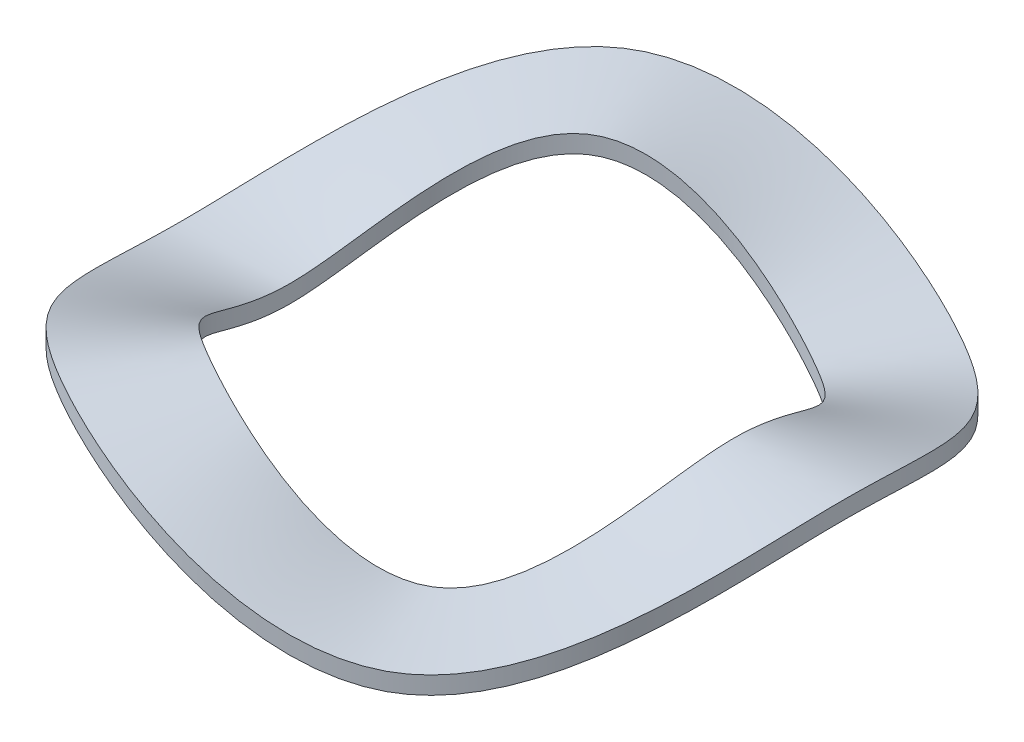
ISO-10303-21;
HEADER;
FILE_DESCRIPTION(('STEP AP214'),'2;1');
FILE_NAME('part.step','',(''),(''),'','','');
FILE_SCHEMA(('AUTOMOTIVE_DESIGN { 1 0 10303 214 1 1 1 1 }'));
ENDSEC;
DATA;
#1=APPLICATION_CONTEXT('core data for automotive mechanical design processes');
#2=APPLICATION_PROTOCOL_DEFINITION('international standard','automotive_design',2000,#1);
#3=PRODUCT_CONTEXT('',#1,'mechanical');
#4=PRODUCT('Part','Part','',(#3));
#5=PRODUCT_RELATED_PRODUCT_CATEGORY('part','',(#4));
#6=PRODUCT_DEFINITION_FORMATION('','',#4);
#7=PRODUCT_DEFINITION_CONTEXT('part definition',#1,'design');
#8=PRODUCT_DEFINITION('design','',#6,#7);
#9=PRODUCT_DEFINITION_SHAPE('','',#8);
#10=(LENGTH_UNIT() NAMED_UNIT(*) SI_UNIT(.MILLI.,.METRE.));
#11=(NAMED_UNIT(*) PLANE_ANGLE_UNIT() SI_UNIT($,.RADIAN.));
#12=(NAMED_UNIT(*) SI_UNIT($,.STERADIAN.) SOLID_ANGLE_UNIT());
#13=UNCERTAINTY_MEASURE_WITH_UNIT(LENGTH_MEASURE(1.E-05),#10,'distance_accuracy_value','');
#14=(GEOMETRIC_REPRESENTATION_CONTEXT(3) GLOBAL_UNCERTAINTY_ASSIGNED_CONTEXT((#13)) GLOBAL_UNIT_ASSIGNED_CONTEXT((#10,
#11,#12)) REPRESENTATION_CONTEXT('',''));
#15=CARTESIAN_POINT('',(0.,0.,0.));
#16=DIRECTION('',(0.,0.,1.));
#17=DIRECTION('',(1.,0.,0.));
#18=AXIS2_PLACEMENT_3D('',#15,#16,#17);
#19=CARTESIAN_POINT('',(-4.7625,0.254,0.));
#20=CARTESIAN_POINT('',(-4.76249999999884,0.254000000000156,-0.0824889197108526));
#21=CARTESIAN_POINT('',(-4.7577374999963,0.260350000000501,-0.247466759132615));
#22=CARTESIAN_POINT('',(-4.73666343749194,0.287020000001092,-0.494314851367588));
#23=CARTESIAN_POINT('',(-4.70201624998713,0.328930000001738,-0.739925609807044));
#24=CARTESIAN_POINT('',(-4.41483749996096,0.660400000000268,-2.20245415625919));
#25=CARTESIAN_POINT('',(-2.47649999987054,2.54000000001252,-4.94933518268951));
#26=CARTESIAN_POINT('',(2.85749999982982,-1.01600000000891,-4.94933518270923));
#27=CARTESIAN_POINT('',(5.71500000003228,2.7939999999834,6.43517764032861E-11));
#28=CARTESIAN_POINT('',(2.85749999998143,-1.01600000000423,4.94933518262236));
#29=CARTESIAN_POINT('',(-2.47649999998527,2.54000000000209,4.94933518262739));
#30=CARTESIAN_POINT('',(-4.41483750001662,0.660399999997793,2.20245415627529));
#31=CARTESIAN_POINT('',(-4.70201625000777,0.328929999998984,0.739925609805655));
#32=CARTESIAN_POINT('',(-4.7366634375058,0.287019999999233,0.494314851366983));
#33=CARTESIAN_POINT('',(-4.75773750000326,0.260349999999564,0.247466759132501));
#34=CARTESIAN_POINT('',(-4.76250000000116,0.253999999999844,0.0824889197108527));
#35=CARTESIAN_POINT('',(-4.7625,0.254,0.));
#36=CARTESIAN_POINT('',(-4.2418,0.254,0.));
#37=CARTESIAN_POINT('',(-4.24179999999897,0.254000000000156,-0.0734701311557993));
#38=CARTESIAN_POINT('',(-4.23755819999671,0.260350000000501,-0.220410393467449));
#39=CARTESIAN_POINT('',(-4.21878823499282,0.287020000001092,-0.440269760951398));
#40=CARTESIAN_POINT('',(-4.18792913998854,0.328930000001738,-0.65902707646814));
#41=CARTESIAN_POINT('',(-3.93214859996523,0.660400000000268,-1.96165250184152));
#42=CARTESIAN_POINT('',(-2.2057359998847,2.54000000001252,-4.40820786938212));
#43=CARTESIAN_POINT('',(2.54507999984843,-1.01600000000891,-4.40820786939969));
#44=CARTESIAN_POINT('',(5.09016000002875,2.7939999999834,5.7316158113066E-11));
#45=CARTESIAN_POINT('',(2.54507999998346,-1.01600000000423,4.40820786932231));
#46=CARTESIAN_POINT('',(-2.20573599998688,2.54000000000209,4.40820786932679));
#47=CARTESIAN_POINT('',(-3.9321486000148,0.660399999997793,1.96165250185586));
#48=CARTESIAN_POINT('',(-4.18792914000692,0.328929999998984,0.659027076466904));
#49=CARTESIAN_POINT('',(-4.21878823500517,0.287019999999233,0.44026976095086));
#50=CARTESIAN_POINT('',(-4.2375582000029,0.260349999999564,0.220410393467348));
#51=CARTESIAN_POINT('',(-4.24180000000103,0.253999999999844,0.0734701311557996));
#52=CARTESIAN_POINT('',(-4.2418,0.254,0.));
#53=CARTESIAN_POINT('',(-3.7211,0.254,0.));
#54=CARTESIAN_POINT('',(-3.72109999999909,0.254000000000156,-0.0644513426007462));
#55=CARTESIAN_POINT('',(-3.71737889999711,0.260350000000501,-0.193354027802283));
#56=CARTESIAN_POINT('',(-3.7009130324937,0.287020000001092,-0.386224670535208));
#57=CARTESIAN_POINT('',(-3.67384202998994,0.328930000001738,-0.578128543129237));
#58=CARTESIAN_POINT('',(-3.4494596999695,0.660400000000268,-1.72085084742385));
#59=CARTESIAN_POINT('',(-1.93497199989885,2.54000000001252,-3.86708055607473));
#60=CARTESIAN_POINT('',(2.23265999986704,-1.01600000000891,-3.86708055609015));
#61=CARTESIAN_POINT('',(4.46532000002522,2.7939999999834,5.02800451556047E-11));
#62=CARTESIAN_POINT('',(2.23265999998549,-1.01600000000423,3.86708055602227));
#63=CARTESIAN_POINT('',(-1.93497199998849,2.54000000000209,3.8670805560262));
#64=CARTESIAN_POINT('',(-3.44945970001299,0.660399999997793,1.72085084743642));
#65=CARTESIAN_POINT('',(-3.67384203000607,0.328929999998984,0.578128543128152));
#66=CARTESIAN_POINT('',(-3.70091303250453,0.287019999999233,0.386224670534736));
#67=CARTESIAN_POINT('',(-3.71737890000255,0.260349999999564,0.193354027802194));
#68=CARTESIAN_POINT('',(-3.72110000000091,0.253999999999844,0.0644513426007462));
#69=CARTESIAN_POINT('',(-3.7211,0.254,0.));
#70=CARTESIAN_POINT('',(-3.2004,0.254,0.));
#71=CARTESIAN_POINT('',(-3.20039999999922,0.254000000000156,-0.0554325540456928));
#72=CARTESIAN_POINT('',(-3.19719959999752,0.260350000000501,-0.166297662137117));
#73=CARTESIAN_POINT('',(-3.18303782999458,0.287020000001092,-0.332179580119019));
#74=CARTESIAN_POINT('',(-3.15975491999135,0.328930000001738,-0.497230009790333));
#75=CARTESIAN_POINT('',(-2.96677079997376,0.660400000000268,-1.48004919300618));
#76=CARTESIAN_POINT('',(-1.664207999913,2.54000000001252,-3.32595324276735));
#77=CARTESIAN_POINT('',(1.92023999988564,-1.01600000000891,-3.3259532427806));
#78=CARTESIAN_POINT('',(3.84048000002169,2.7939999999834,4.32446335414238E-11));
#79=CARTESIAN_POINT('',(1.92023999998752,-1.01600000000423,3.32595324272222));
#80=CARTESIAN_POINT('',(-1.6642079999901,2.54000000000209,3.3259532427256));
#81=CARTESIAN_POINT('',(-2.96677080001117,0.660399999997793,1.48004919301699));
#82=CARTESIAN_POINT('',(-3.15975492000523,0.328929999998984,0.4972300097894));
#83=CARTESIAN_POINT('',(-3.1830378300039,0.287019999999233,0.332179580118612));
#84=CARTESIAN_POINT('',(-3.19719960000219,0.260349999999564,0.166297662137041));
#85=CARTESIAN_POINT('',(-3.20040000000078,0.253999999999844,0.055432554045693));
#86=CARTESIAN_POINT('',(-3.2004,0.254,0.));
#87=B_SPLINE_SURFACE_WITH_KNOTS('',3,3,((#19,#20,#21,#22,#23,#24,#25,#26,#27,#28,#29,#30,#31,
#32,#33,#34,#35),(#36,#37,#38,#39,#40,#41,#42,#43,#44,#45,#46,#47,#48,#49,#50,#51,#52),(#53,#54,
#55,#56,#57,#58,#59,#60,#61,#62,#63,#64,#65,#66,#67,#68,#69),(#70,#71,#72,#73,#74,#75,#76,#77,
#78,#79,#80,#81,#82,#83,#84,#85,#86)),.UNSPECIFIED.,.F.,.T.,.F.,(4,4),(4,1,1,1,1,1,1,1,1,1,1,1,
1,1,4),(0.,1.),(0.,0.0083333333333333,0.0166666666666666,0.0250000000000001,0.0333333333333334,
0.166666666664162,0.333333333337267,0.5,0.666666666666667,0.833333333333398,0.966666666666667,
0.975,0.983333333333333,0.991666666666667,1.),.UNSPECIFIED.);
#88=CARTESIAN_POINT('',(-4.7625,0.254,0.));
#89=CARTESIAN_POINT('',(-4.76249999999884,0.254000000000156,-0.0824889197108526));
#90=CARTESIAN_POINT('',(-4.7577374999963,0.260350000000501,-0.247466759132615));
#91=CARTESIAN_POINT('',(-4.73666343749194,0.287020000001092,-0.494314851367588));
#92=CARTESIAN_POINT('',(-4.70201624998713,0.328930000001738,-0.739925609807044));
#93=CARTESIAN_POINT('',(-4.41483749996096,0.660400000000268,-2.20245415625919));
#94=CARTESIAN_POINT('',(-2.47649999987054,2.54000000001252,-4.94933518268951));
#95=CARTESIAN_POINT('',(2.85749999982982,-1.01600000000891,-4.94933518270923));
#96=CARTESIAN_POINT('',(5.71500000003228,2.7939999999834,6.43517764032861E-11));
#97=CARTESIAN_POINT('',(2.85749999998143,-1.01600000000423,4.94933518262236));
#98=CARTESIAN_POINT('',(-2.47649999998527,2.54000000000209,4.94933518262739));
#99=CARTESIAN_POINT('',(-4.41483750001662,0.660399999997793,2.20245415627529));
#100=CARTESIAN_POINT('',(-4.70201625000777,0.328929999998984,0.739925609805655));
#101=CARTESIAN_POINT('',(-4.7366634375058,0.287019999999233,0.494314851366983));
#102=CARTESIAN_POINT('',(-4.75773750000326,0.260349999999564,0.247466759132501));
#103=CARTESIAN_POINT('',(-4.76250000000116,0.253999999999844,0.0824889197108527));
#104=CARTESIAN_POINT('',(-4.7625,0.254,0.));
#105=B_SPLINE_CURVE_WITH_KNOTS('',3,(#88,#89,#90,#91,#92,#93,#94,#95,#96,#97,#98,#99,#100,#101,
#102,#103,#104),.UNSPECIFIED.,.T.,.F.,(4,1,1,1,1,1,1,1,1,1,1,1,1,1,4),(0.,0.0083333333333333,
0.0166666666666666,0.0250000000000001,0.0333333333333334,0.166666666664162,0.333333333337267,
0.5,0.666666666666667,0.833333333333398,0.966666666666667,0.975,0.983333333333333,
0.991666666666667,1.),.UNSPECIFIED.);
#106=CARTESIAN_POINT('',(-4.7625,0.254,0.));
#107=VERTEX_POINT('',#106);
#108=EDGE_CURVE('E11',#107,#107,#105,.F.);
#109=CARTESIAN_POINT('',(-3.2004,0.254,0.));
#110=CARTESIAN_POINT('',(-3.20039999999922,0.254000000000156,-0.0554325540456928));
#111=CARTESIAN_POINT('',(-3.19719959999752,0.260350000000501,-0.166297662137117));
#112=CARTESIAN_POINT('',(-3.18303782999458,0.287020000001092,-0.332179580119019));
#113=CARTESIAN_POINT('',(-3.15975491999135,0.328930000001738,-0.497230009790333));
#114=CARTESIAN_POINT('',(-2.96677079997376,0.660400000000268,-1.48004919300618));
#115=CARTESIAN_POINT('',(-1.664207999913,2.54000000001252,-3.32595324276735));
#116=CARTESIAN_POINT('',(1.92023999988564,-1.01600000000891,-3.3259532427806));
#117=CARTESIAN_POINT('',(3.84048000002169,2.7939999999834,4.32446335414238E-11));
#118=CARTESIAN_POINT('',(1.92023999998752,-1.01600000000423,3.32595324272222));
#119=CARTESIAN_POINT('',(-1.6642079999901,2.54000000000209,3.3259532427256));
#120=CARTESIAN_POINT('',(-2.96677080001117,0.660399999997793,1.48004919301699));
#121=CARTESIAN_POINT('',(-3.15975492000523,0.328929999998984,0.4972300097894));
#122=CARTESIAN_POINT('',(-3.1830378300039,0.287019999999233,0.332179580118612));
#123=CARTESIAN_POINT('',(-3.19719960000219,0.260349999999564,0.166297662137041));
#124=CARTESIAN_POINT('',(-3.20040000000078,0.253999999999844,0.055432554045693));
#125=CARTESIAN_POINT('',(-3.2004,0.254,0.));
#126=B_SPLINE_CURVE_WITH_KNOTS('',3,(#109,#110,#111,#112,#113,#114,#115,#116,#117,#118,#119,
#120,#121,#122,#123,#124,#125),.UNSPECIFIED.,.T.,.F.,(4,1,1,1,1,1,1,1,1,1,1,1,1,1,4),(0.,
0.0083333333333333,0.0166666666666666,0.0250000000000001,0.0333333333333334,0.166666666664162,
0.333333333337267,0.5,0.666666666666667,0.833333333333398,0.966666666666667,0.975,
0.983333333333333,0.991666666666667,1.),.UNSPECIFIED.);
#127=CARTESIAN_POINT('',(-3.2004,0.254,0.));
#128=VERTEX_POINT('',#127);
#129=EDGE_CURVE('E58',#128,#128,#126,.T.);
#130=ORIENTED_EDGE('',*,*,#108,.T.);
#131=EDGE_LOOP('',(#130));
#132=FACE_BOUND('',#131,.T.);
#133=ORIENTED_EDGE('',*,*,#129,.T.);
#134=EDGE_LOOP('',(#133));
#135=FACE_BOUND('',#134,.T.);
#136=ADVANCED_FACE('F46',(#132,#135),#87,.T.);
#137=CARTESIAN_POINT('',(-4.7625,0.,0.));
#138=CARTESIAN_POINT('',(-4.76249999999884,1.55996787346404E-13,-0.0824889197108526));
#139=CARTESIAN_POINT('',(-4.7577374999963,0.00635000000050028,-0.247466759132615));
#140=CARTESIAN_POINT('',(-4.73666343749194,0.033020000001092,-0.494314851367587));
#141=CARTESIAN_POINT('',(-4.70201624998713,0.0749300000017376,-0.739925609807044));
#142=CARTESIAN_POINT('',(-4.41483749996096,0.406400000000268,-2.20245415625919));
#143=CARTESIAN_POINT('',(-2.47649999987054,2.28600000001252,-4.9493351826895));
#144=CARTESIAN_POINT('',(2.85749999982982,-1.27000000000891,-4.94933518270923));
#145=CARTESIAN_POINT('',(5.71500000003228,2.5399999999834,6.43517560744954E-11));
#146=CARTESIAN_POINT('',(2.85749999998143,-1.27000000000423,4.94933518262236));
#147=CARTESIAN_POINT('',(-2.47649999998527,2.28600000000209,4.94933518262739));
#148=CARTESIAN_POINT('',(-4.41483750001662,0.406399999997793,2.20245415627529));
#149=CARTESIAN_POINT('',(-4.70201625000778,0.0749299999989841,0.739925609805655));
#150=CARTESIAN_POINT('',(-4.7366634375058,0.0330199999992332,0.494314851366983));
#151=CARTESIAN_POINT('',(-4.75773750000326,0.00634999999956399,0.247466759132501));
#152=CARTESIAN_POINT('',(-4.76250000000116,-1.56099701849495E-13,0.0824889197108527));
#153=CARTESIAN_POINT('',(-4.7625,0.,0.));
#154=CARTESIAN_POINT('',(-4.7625,0.0211666666666668,0.));
#155=CARTESIAN_POINT('',(-4.76249999999884,0.0211666666668228,-0.0824889197108526));
#156=CARTESIAN_POINT('',(-4.7577374999963,0.0275166666671671,-0.247466759132615));
#157=CARTESIAN_POINT('',(-4.73666343749194,0.0541866666677588,-0.494314851367587));
#158=CARTESIAN_POINT('',(-4.70201624998713,0.0960966666684045,-0.739925609807044));
#159=CARTESIAN_POINT('',(-4.41483749996096,0.427566666666935,-2.20245415625919));
#160=CARTESIAN_POINT('',(-2.47649999987054,2.30716666667919,-4.9493351826895));
#161=CARTESIAN_POINT('',(2.85749999982982,-1.24883333334224,-4.94933518270923));
#162=CARTESIAN_POINT('',(5.71500000003228,2.56116666665007,6.43517560744954E-11));
#163=CARTESIAN_POINT('',(2.85749999998143,-1.24883333333756,4.94933518262236));
#164=CARTESIAN_POINT('',(-2.47649999998527,2.30716666666876,4.94933518262739));
#165=CARTESIAN_POINT('',(-4.41483750001662,0.42756666666446,2.20245415627529));
#166=CARTESIAN_POINT('',(-4.70201625000778,0.0960966666656509,0.739925609805655));
#167=CARTESIAN_POINT('',(-4.7366634375058,0.0541866666659001,0.494314851366983));
#168=CARTESIAN_POINT('',(-4.75773750000326,0.0275166666662308,0.247466759132501));
#169=CARTESIAN_POINT('',(-4.76250000000116,0.0211666666665107,0.0824889197108527));
#170=CARTESIAN_POINT('',(-4.7625,0.0211666666666668,0.));
#171=CARTESIAN_POINT('',(-4.7625,0.0635000000000002,0.));
#172=CARTESIAN_POINT('',(-4.76249999999884,0.0635000000001563,-0.0824889197108526));
#173=CARTESIAN_POINT('',(-4.7577374999963,0.0698500000005006,-0.247466759132615));
#174=CARTESIAN_POINT('',(-4.73666343749194,0.0965200000010923,-0.494314851367588));
#175=CARTESIAN_POINT('',(-4.70201624998713,0.138430000001738,-0.739925609807044));
#176=CARTESIAN_POINT('',(-4.41483749996096,0.469900000000268,-2.20245415625919));
#177=CARTESIAN_POINT('',(-2.47649999987055,2.34950000001252,-4.9493351826895));
#178=CARTESIAN_POINT('',(2.85749999982983,-1.20650000000891,-4.94933518270923));
#179=CARTESIAN_POINT('',(5.71500000003227,2.6034999999834,6.4353768624778E-11));
#180=CARTESIAN_POINT('',(2.85749999998143,-1.20650000000422,4.94933518262236));
#181=CARTESIAN_POINT('',(-2.47649999998528,2.34950000000209,4.94933518262739));
#182=CARTESIAN_POINT('',(-4.41483750001662,0.469899999997793,2.20245415627529));
#183=CARTESIAN_POINT('',(-4.70201625000777,0.138429999998984,0.739925609805655));
#184=CARTESIAN_POINT('',(-4.7366634375058,0.0965199999992334,0.494314851366983));
#185=CARTESIAN_POINT('',(-4.75773750000326,0.0698499999995642,0.247466759132501));
#186=CARTESIAN_POINT('',(-4.76250000000116,0.0634999999998442,0.0824889197108526));
#187=CARTESIAN_POINT('',(-4.7625,0.0635000000000002,0.));
#188=CARTESIAN_POINT('',(-4.7625,0.127,0.));
#189=CARTESIAN_POINT('',(-4.76249999999884,0.127000000000156,-0.0824889197108527));
#190=CARTESIAN_POINT('',(-4.75773749999631,0.133350000000501,-0.247466759132615));
#191=CARTESIAN_POINT('',(-4.73666343749195,0.160020000001092,-0.494314851367588));
#192=CARTESIAN_POINT('',(-4.70201624998713,0.201930000001738,-0.739925609807044));
#193=CARTESIAN_POINT('',(-4.41483749996096,0.533400000000269,-2.20245415625919));
#194=CARTESIAN_POINT('',(-2.47649999987054,2.41300000001252,-4.94933518268951));
#195=CARTESIAN_POINT('',(2.85749999982981,-1.14300000000891,-4.94933518270922));
#196=CARTESIAN_POINT('',(5.71500000003229,2.66699999998341,6.43488829387383E-11));
#197=CARTESIAN_POINT('',(2.85749999998142,-1.14300000000423,4.94933518262236));
#198=CARTESIAN_POINT('',(-2.47649999998526,2.4130000000021,4.94933518262738));
#199=CARTESIAN_POINT('',(-4.41483750001662,0.533399999997794,2.20245415627529));
#200=CARTESIAN_POINT('',(-4.70201625000778,0.201929999998985,0.739925609805655));
#201=CARTESIAN_POINT('',(-4.7366634375058,0.160019999999234,0.494314851366983));
#202=CARTESIAN_POINT('',(-4.75773750000326,0.133349999999564,0.247466759132501));
#203=CARTESIAN_POINT('',(-4.76250000000116,0.126999999999844,0.0824889197108526));
#204=CARTESIAN_POINT('',(-4.7625,0.127,0.));
#205=CARTESIAN_POINT('',(-4.7625,0.1905,0.));
#206=CARTESIAN_POINT('',(-4.76249999999884,0.190500000000156,-0.0824889197108527));
#207=CARTESIAN_POINT('',(-4.7577374999963,0.196850000000501,-0.247466759132615));
#208=CARTESIAN_POINT('',(-4.73666343749194,0.223520000001092,-0.494314851367588));
#209=CARTESIAN_POINT('',(-4.70201624998713,0.265430000001738,-0.739925609807044));
#210=CARTESIAN_POINT('',(-4.41483749996096,0.596900000000268,-2.20245415625919));
#211=CARTESIAN_POINT('',(-2.47649999987055,2.47650000001252,-4.9493351826895));
#212=CARTESIAN_POINT('',(2.85749999982983,-1.07950000000891,-4.94933518270923));
#213=CARTESIAN_POINT('',(5.71500000003227,2.7304999999834,6.43526708700784E-11));
#214=CARTESIAN_POINT('',(2.85749999998143,-1.07950000000422,4.94933518262236));
#215=CARTESIAN_POINT('',(-2.47649999998528,2.47650000000209,4.94933518262739));
#216=CARTESIAN_POINT('',(-4.41483750001662,0.596899999997792,2.20245415627529));
#217=CARTESIAN_POINT('',(-4.70201625000777,0.265429999998984,0.739925609805655));
#218=CARTESIAN_POINT('',(-4.7366634375058,0.223519999999233,0.494314851366983));
#219=CARTESIAN_POINT('',(-4.75773750000326,0.196849999999564,0.247466759132501));
#220=CARTESIAN_POINT('',(-4.76250000000116,0.190499999999844,0.0824889197108525));
#221=CARTESIAN_POINT('',(-4.7625,0.1905,0.));
#222=CARTESIAN_POINT('',(-4.7625,0.232833333333333,0.));
#223=CARTESIAN_POINT('',(-4.76249999999884,0.232833333333489,-0.0824889197108526));
#224=CARTESIAN_POINT('',(-4.7577374999963,0.239183333333834,-0.247466759132615));
#225=CARTESIAN_POINT('',(-4.73666343749194,0.265853333334425,-0.494314851367588));
#226=CARTESIAN_POINT('',(-4.70201624998713,0.307763333335071,-0.739925609807044));
#227=CARTESIAN_POINT('',(-4.41483749996096,0.639233333333601,-2.20245415625919));
#228=CARTESIAN_POINT('',(-2.47649999987054,2.51883333334585,-4.9493351826895));
#229=CARTESIAN_POINT('',(2.85749999982982,-1.03716666667557,-4.94933518270923));
#230=CARTESIAN_POINT('',(5.71500000003228,2.77283333331674,6.43519593624027E-11));
#231=CARTESIAN_POINT('',(2.85749999998143,-1.03716666667089,4.94933518262236));
#232=CARTESIAN_POINT('',(-2.47649999998527,2.51883333333543,4.94933518262739));
#233=CARTESIAN_POINT('',(-4.41483750001662,0.639233333331126,2.20245415627529));
#234=CARTESIAN_POINT('',(-4.70201625000777,0.307763333332317,0.739925609805655));
#235=CARTESIAN_POINT('',(-4.7366634375058,0.265853333332567,0.494314851366983));
#236=CARTESIAN_POINT('',(-4.75773750000326,0.239183333332897,0.247466759132501));
#237=CARTESIAN_POINT('',(-4.76250000000116,0.232833333333177,0.0824889197108526));
#238=CARTESIAN_POINT('',(-4.7625,0.232833333333333,0.));
#239=CARTESIAN_POINT('',(-4.7625,0.254,0.));
#240=CARTESIAN_POINT('',(-4.76249999999884,0.254000000000156,-0.0824889197108526));
#241=CARTESIAN_POINT('',(-4.7577374999963,0.260350000000501,-0.247466759132615));
#242=CARTESIAN_POINT('',(-4.73666343749194,0.287020000001092,-0.494314851367588));
#243=CARTESIAN_POINT('',(-4.70201624998713,0.328930000001738,-0.739925609807044));
#244=CARTESIAN_POINT('',(-4.41483749996096,0.660400000000268,-2.20245415625919));
#245=CARTESIAN_POINT('',(-2.47649999987054,2.54000000001252,-4.9493351826895));
#246=CARTESIAN_POINT('',(2.85749999982982,-1.01600000000891,-4.94933518270923));
#247=CARTESIAN_POINT('',(5.71500000003228,2.7939999999834,6.43519593624027E-11));
#248=CARTESIAN_POINT('',(2.85749999998143,-1.01600000000423,4.94933518262236));
#249=CARTESIAN_POINT('',(-2.47649999998527,2.54000000000209,4.94933518262739));
#250=CARTESIAN_POINT('',(-4.41483750001662,0.660399999997793,2.20245415627529));
#251=CARTESIAN_POINT('',(-4.70201625000777,0.328929999998984,0.739925609805655));
#252=CARTESIAN_POINT('',(-4.7366634375058,0.287019999999233,0.494314851366983));
#253=CARTESIAN_POINT('',(-4.75773750000326,0.260349999999564,0.247466759132501));
#254=CARTESIAN_POINT('',(-4.76250000000116,0.253999999999844,0.0824889197108526));
#255=CARTESIAN_POINT('',(-4.7625,0.254,0.));
#256=B_SPLINE_SURFACE_WITH_KNOTS('',3,3,((#137,#138,#139,#140,#141,#142,#143,#144,#145,#146,
#147,#148,#149,#150,#151,#152,#153),(#154,#155,#156,#157,#158,#159,#160,#161,#162,#163,#164,
#165,#166,#167,#168,#169,#170),(#171,#172,#173,#174,#175,#176,#177,#178,#179,#180,#181,#182,
#183,#184,#185,#186,#187),(#188,#189,#190,#191,#192,#193,#194,#195,#196,#197,#198,#199,#200,
#201,#202,#203,#204),(#205,#206,#207,#208,#209,#210,#211,#212,#213,#214,#215,#216,#217,#218,
#219,#220,#221),(#222,#223,#224,#225,#226,#227,#228,#229,#230,#231,#232,#233,#234,#235,#236,
#237,#238),(#239,#240,#241,#242,#243,#244,#245,#246,#247,#248,#249,#250,#251,#252,#253,#254,
#255)),.UNSPECIFIED.,.F.,.T.,.F.,(4,1,1,1,4),(4,1,1,1,1,1,1,1,1,1,1,1,1,1,4),(0.877300613496933,
0.907975460122699,0.938650306748466,0.969325153374233,1.),(0.,0.0083333333333333,
0.0166666666666666,0.0250000000000001,0.0333333333333334,0.166666666664162,0.333333333337267,
0.5,0.666666666666667,0.833333333333398,0.966666666666667,0.975,0.983333333333333,
0.991666666666667,1.),.UNSPECIFIED.);
#257=CARTESIAN_POINT('',(-4.7625,0.,0.));
#258=CARTESIAN_POINT('',(-4.76249999999884,1.55996787346404E-13,-0.0824889197108526));
#259=CARTESIAN_POINT('',(-4.7577374999963,0.00635000000050028,-0.247466759132615));
#260=CARTESIAN_POINT('',(-4.73666343749194,0.033020000001092,-0.494314851367587));
#261=CARTESIAN_POINT('',(-4.70201624998713,0.0749300000017376,-0.739925609807044));
#262=CARTESIAN_POINT('',(-4.41483749996096,0.406400000000268,-2.20245415625919));
#263=CARTESIAN_POINT('',(-2.47649999987054,2.28600000001252,-4.9493351826895));
#264=CARTESIAN_POINT('',(2.85749999982982,-1.27000000000891,-4.94933518270923));
#265=CARTESIAN_POINT('',(5.71500000003228,2.5399999999834,6.43517560744954E-11));
#266=CARTESIAN_POINT('',(2.85749999998143,-1.27000000000423,4.94933518262236));
#267=CARTESIAN_POINT('',(-2.47649999998527,2.28600000000209,4.94933518262739));
#268=CARTESIAN_POINT('',(-4.41483750001662,0.406399999997793,2.20245415627529));
#269=CARTESIAN_POINT('',(-4.70201625000778,0.0749299999989841,0.739925609805655));
#270=CARTESIAN_POINT('',(-4.7366634375058,0.0330199999992332,0.494314851366983));
#271=CARTESIAN_POINT('',(-4.75773750000326,0.00634999999956399,0.247466759132501));
#272=CARTESIAN_POINT('',(-4.76250000000116,-1.56099701849495E-13,0.0824889197108527));
#273=CARTESIAN_POINT('',(-4.7625,0.,0.));
#274=B_SPLINE_CURVE_WITH_KNOTS('',3,(#257,#258,#259,#260,#261,#262,#263,#264,#265,#266,#267,
#268,#269,#270,#271,#272,#273),.UNSPECIFIED.,.T.,.F.,(4,1,1,1,1,1,1,1,1,1,1,1,1,1,4),(0.,
0.0083333333333333,0.0166666666666666,0.0250000000000001,0.0333333333333334,0.166666666664162,
0.333333333337267,0.5,0.666666666666667,0.833333333333398,0.966666666666667,0.975,
0.983333333333333,0.991666666666667,1.),.UNSPECIFIED.);
#275=CARTESIAN_POINT('',(-4.7625,0.,0.));
#276=VERTEX_POINT('',#275);
#277=EDGE_CURVE('E52',#276,#276,#274,.T.);
#278=ORIENTED_EDGE('',*,*,#108,.F.);
#279=EDGE_LOOP('',(#278));
#280=FACE_BOUND('',#279,.T.);
#281=ORIENTED_EDGE('',*,*,#277,.F.);
#282=EDGE_LOOP('',(#281));
#283=FACE_BOUND('',#282,.T.);
#284=ADVANCED_FACE('F48',(#280,#283),#256,.T.);
#285=CARTESIAN_POINT('',(-3.2004,0.,0.));
#286=CARTESIAN_POINT('',(-3.20039999999922,1.55996787346404E-13,-0.0554325540456927));
#287=CARTESIAN_POINT('',(-3.19719959999752,0.00635000000050028,-0.166297662137117));
#288=CARTESIAN_POINT('',(-3.18303782999459,0.033020000001092,-0.332179580119019));
#289=CARTESIAN_POINT('',(-3.15975491999135,0.0749300000017376,-0.497230009790333));
#290=CARTESIAN_POINT('',(-2.96677079997377,0.406400000000268,-1.48004919300618));
#291=CARTESIAN_POINT('',(-1.664207999913,2.28600000001252,-3.32595324276735));
#292=CARTESIAN_POINT('',(1.92023999988564,-1.27000000000891,-3.3259532427806));
#293=CARTESIAN_POINT('',(3.84048000002169,2.5399999999834,4.32446199888966E-11));
#294=CARTESIAN_POINT('',(1.92023999998752,-1.27000000000423,3.32595324272222));
#295=CARTESIAN_POINT('',(-1.6642079999901,2.28600000000209,3.3259532427256));
#296=CARTESIAN_POINT('',(-2.96677080001117,0.406399999997793,1.48004919301699));
#297=CARTESIAN_POINT('',(-3.15975492000523,0.0749299999989841,0.4972300097894));
#298=CARTESIAN_POINT('',(-3.1830378300039,0.0330199999992332,0.332179580118613));
#299=CARTESIAN_POINT('',(-3.19719960000219,0.00634999999956399,0.166297662137041));
#300=CARTESIAN_POINT('',(-3.20040000000078,-1.56099701849495E-13,0.0554325540456932));
#301=CARTESIAN_POINT('',(-3.2004,0.,0.));
#302=CARTESIAN_POINT('',(-3.330575,0.,0.));
#303=CARTESIAN_POINT('',(-3.33057499999919,1.55996787346404E-13,-0.0576872511844562));
#304=CARTESIAN_POINT('',(-3.32724442499741,0.00635000000050028,-0.173061753553409));
#305=CARTESIAN_POINT('',(-3.31250663061936,0.033020000001092,-0.345690852723066));
#306=CARTESIAN_POINT('',(-3.288276697491,0.0749300000017376,-0.517454643125059));
#307=CARTESIAN_POINT('',(-3.0874430249727,0.406400000000268,-1.54024960661059));
#308=CARTESIAN_POINT('',(-1.73189899990947,2.28600000001252,-3.46123507109419));
#309=CARTESIAN_POINT('',(1.99834499988099,-1.27000000000891,-3.46123507110799));
#310=CARTESIAN_POINT('',(3.99669000002257,2.5399999999834,4.50031213737687E-11));
#311=CARTESIAN_POINT('',(1.99834499998701,-1.27000000000423,3.46123507104724));
#312=CARTESIAN_POINT('',(-1.7318989999897,2.28600000000209,3.46123507105075));
#313=CARTESIAN_POINT('',(-3.08744302501162,0.406399999997793,1.54024960662185));
#314=CARTESIAN_POINT('',(-3.28827669750544,0.0749299999989841,0.517454643124088));
#315=CARTESIAN_POINT('',(-3.31250663062906,0.0330199999992332,0.345690852722643));
#316=CARTESIAN_POINT('',(-3.32724442500228,0.00634999999956399,0.173061753553329));
#317=CARTESIAN_POINT('',(-3.33057500000081,-1.56099701849495E-13,0.0576872511844563));
#318=CARTESIAN_POINT('',(-3.330575,0.,0.));
#319=CARTESIAN_POINT('',(-3.590925,0.,0.));
#320=CARTESIAN_POINT('',(-3.59092499999913,1.56156876573435E-13,-0.0621966454619827));
#321=CARTESIAN_POINT('',(-3.58733407499721,0.00635000000050046,-0.186589936385991));
#322=CARTESIAN_POINT('',(-3.57144423186893,0.0330200000010922,-0.372713397931161));
#323=CARTESIAN_POINT('',(-3.5453202524903,0.0749300000017379,-0.557903909794511));
#324=CARTESIAN_POINT('',(-3.32878747497056,0.406400000000268,-1.66065043381943));
#325=CARTESIAN_POINT('',(-1.86728099990239,2.28600000001252,-3.73179872774789));
#326=CARTESIAN_POINT('',(2.15455499987169,-1.27000000000891,-3.73179872776276));
#327=CARTESIAN_POINT('',(4.30911000002434,2.53999999998341,4.85217673874307E-11));
#328=CARTESIAN_POINT('',(2.154554999986,-1.27000000000423,3.73179872769726));
#329=CARTESIAN_POINT('',(-1.8672809999889,2.28600000000209,3.73179872770105));
#330=CARTESIAN_POINT('',(-3.32878747501253,0.406399999997793,1.66065043383157));
#331=CARTESIAN_POINT('',(-3.54532025250586,0.0749299999989843,0.557903909793464));
#332=CARTESIAN_POINT('',(-3.57144423187937,0.0330199999992334,0.372713397930705));
#333=CARTESIAN_POINT('',(-3.58733407500246,0.00634999999956414,0.186589936385906));
#334=CARTESIAN_POINT('',(-3.59092500000088,-1.55949777017831E-13,0.0621966454619831));
#335=CARTESIAN_POINT('',(-3.590925,0.,0.));
#336=CARTESIAN_POINT('',(-3.98145,0.,0.));
#337=CARTESIAN_POINT('',(-3.98144999999903,1.56209816132638E-13,-0.0689607368782727));
#338=CARTESIAN_POINT('',(-3.97746854999691,0.0063500000005005,-0.206882210634866));
#339=CARTESIAN_POINT('',(-3.95985063374326,0.0330200000010922,-0.413247215743303));
#340=CARTESIAN_POINT('',(-3.93088558498924,0.0749300000017378,-0.618577809798688));
#341=CARTESIAN_POINT('',(-3.69080414996736,0.406400000000268,-1.84125167463268));
#342=CARTESIAN_POINT('',(-2.07035399989177,2.28600000001252,-4.13764421272843));
#343=CARTESIAN_POINT('',(2.38886999985773,-1.27000000000891,-4.13764421274491));
#344=CARTESIAN_POINT('',(4.77774000002698,2.5399999999834,5.37968310849145E-11));
#345=CARTESIAN_POINT('',(2.38886999998447,-1.27000000000422,4.13764421267229));
#346=CARTESIAN_POINT('',(-2.07035399998768,2.28600000000209,4.13764421267649));
#347=CARTESIAN_POINT('',(-3.6908041500139,0.406399999997793,1.84125167464614));
#348=CARTESIAN_POINT('',(-3.9308855850065,0.0749299999989842,0.618577809797527));
#349=CARTESIAN_POINT('',(-3.95985063375485,0.0330199999992334,0.413247215742798));
#350=CARTESIAN_POINT('',(-3.97746855000273,0.00634999999956418,0.206882210634771));
#351=CARTESIAN_POINT('',(-3.98145000000097,-1.55894296359786E-13,0.0689607368782729));
#352=CARTESIAN_POINT('',(-3.98145,0.,0.));
#353=CARTESIAN_POINT('',(-4.371975,0.,0.));
#354=CARTESIAN_POINT('',(-4.37197499999893,1.56212780747953E-13,-0.0757248282945628));
#355=CARTESIAN_POINT('',(-4.3676030249966,0.00635000000050051,-0.22717448488374));
#356=CARTESIAN_POINT('',(-4.3482570356176,0.0330200000010923,-0.453781033555445));
#357=CARTESIAN_POINT('',(-4.31645091748818,0.0749300000017379,-0.679251709802867));
#358=CARTESIAN_POINT('',(-4.05282082496416,0.406400000000268,-2.02185291544594));
#359=CARTESIAN_POINT('',(-2.27342699988116,2.28600000001252,-4.54348969770896));
#360=CARTESIAN_POINT('',(2.62318499984378,-1.27000000000891,-4.54348969772708));
#361=CARTESIAN_POINT('',(5.24637000002963,2.5399999999834,5.90755810697847E-11));
#362=CARTESIAN_POINT('',(2.62318499998295,-1.27000000000423,4.54348969764732));
#363=CARTESIAN_POINT('',(-2.27342699998648,2.28600000000209,4.54348969765194));
#364=CARTESIAN_POINT('',(-4.05282082501526,0.406399999997793,2.02185291546071));
#365=CARTESIAN_POINT('',(-4.31645091750714,0.0749299999989844,0.679251709801591));
#366=CARTESIAN_POINT('',(-4.34825703563032,0.0330199999992335,0.45378103355489));
#367=CARTESIAN_POINT('',(-4.36760302500299,0.0063499999995642,0.227174484883636));
#368=CARTESIAN_POINT('',(-4.37197500000106,-1.55889214162102E-13,0.0757248282945627));
#369=CARTESIAN_POINT('',(-4.371975,0.,0.));
#370=CARTESIAN_POINT('',(-4.632325,0.,0.));
#371=CARTESIAN_POINT('',(-4.63232499999887,1.55996787346404E-13,-0.0802342225720891));
#372=CARTESIAN_POINT('',(-4.6276926749964,0.00635000000050028,-0.240702667716323));
#373=CARTESIAN_POINT('',(-4.60719463686716,0.033020000001092,-0.48080357876354));
#374=CARTESIAN_POINT('',(-4.57349447248748,0.0749300000017376,-0.719700976472318));
#375=CARTESIAN_POINT('',(-4.29416527496203,0.406400000000268,-2.14225374265477));
#376=CARTESIAN_POINT('',(-2.40880899987408,2.28600000001252,-4.81405335436266));
#377=CARTESIAN_POINT('',(2.77939499983447,-1.27000000000891,-4.81405335438185));
#378=CARTESIAN_POINT('',(5.5587900000314,2.5399999999834,6.25925635107383E-11));
#379=CARTESIAN_POINT('',(2.77939499998193,-1.27000000000423,4.81405335429735));
#380=CARTESIAN_POINT('',(-2.40880899998567,2.28600000000209,4.81405335430224));
#381=CARTESIAN_POINT('',(-4.29416527501617,0.406399999997793,2.14225374267043));
#382=CARTESIAN_POINT('',(-4.57349447250756,0.0749299999989841,0.719700976470967));
#383=CARTESIAN_POINT('',(-4.60719463688064,0.0330199999992332,0.480803578762952));
#384=CARTESIAN_POINT('',(-4.62769267500317,0.00634999999956399,0.240702667716213));
#385=CARTESIAN_POINT('',(-4.63232500000113,-1.56099701849495E-13,0.0802342225720895));
#386=CARTESIAN_POINT('',(-4.632325,0.,0.));
#387=CARTESIAN_POINT('',(-4.7625,0.,0.));
#388=CARTESIAN_POINT('',(-4.76249999999884,1.55996787346404E-13,-0.0824889197108526));
#389=CARTESIAN_POINT('',(-4.7577374999963,0.00635000000050028,-0.247466759132615));
#390=CARTESIAN_POINT('',(-4.73666343749194,0.033020000001092,-0.494314851367587));
#391=CARTESIAN_POINT('',(-4.70201624998713,0.0749300000017376,-0.739925609807044));
#392=CARTESIAN_POINT('',(-4.41483749996096,0.406400000000268,-2.20245415625919));
#393=CARTESIAN_POINT('',(-2.47649999987054,2.28600000001252,-4.9493351826895));
#394=CARTESIAN_POINT('',(2.85749999982982,-1.27000000000891,-4.94933518270923));
#395=CARTESIAN_POINT('',(5.71500000003228,2.5399999999834,6.43517560744954E-11));
#396=CARTESIAN_POINT('',(2.85749999998143,-1.27000000000423,4.94933518262236));
#397=CARTESIAN_POINT('',(-2.47649999998527,2.28600000000209,4.94933518262739));
#398=CARTESIAN_POINT('',(-4.41483750001662,0.406399999997793,2.20245415627529));
#399=CARTESIAN_POINT('',(-4.70201625000778,0.0749299999989841,0.739925609805655));
#400=CARTESIAN_POINT('',(-4.7366634375058,0.0330199999992332,0.494314851366983));
#401=CARTESIAN_POINT('',(-4.75773750000326,0.00634999999956399,0.247466759132501));
#402=CARTESIAN_POINT('',(-4.76250000000116,-1.56099701849495E-13,0.0824889197108527));
#403=CARTESIAN_POINT('',(-4.7625,0.,0.));
#404=B_SPLINE_SURFACE_WITH_KNOTS('',3,3,((#285,#286,#287,#288,#289,#290,#291,#292,#293,#294,
#295,#296,#297,#298,#299,#300,#301),(#302,#303,#304,#305,#306,#307,#308,#309,#310,#311,#312,
#313,#314,#315,#316,#317,#318),(#319,#320,#321,#322,#323,#324,#325,#326,#327,#328,#329,#330,
#331,#332,#333,#334,#335),(#336,#337,#338,#339,#340,#341,#342,#343,#344,#345,#346,#347,#348,
#349,#350,#351,#352),(#353,#354,#355,#356,#357,#358,#359,#360,#361,#362,#363,#364,#365,#366,
#367,#368,#369),(#370,#371,#372,#373,#374,#375,#376,#377,#378,#379,#380,#381,#382,#383,#384,
#385,#386),(#387,#388,#389,#390,#391,#392,#393,#394,#395,#396,#397,#398,#399,#400,#401,#402,
#403)),.UNSPECIFIED.,.F.,.T.,.F.,(4,1,1,1,4),(4,1,1,1,1,1,1,1,1,1,1,1,1,1,4),(0.122699386503067,
0.311349693251534,0.5,0.688650306748466,0.877300613496933),(0.,0.0083333333333333,
0.0166666666666666,0.0250000000000001,0.0333333333333334,0.166666666664162,0.333333333337267,
0.5,0.666666666666667,0.833333333333398,0.966666666666667,0.975,0.983333333333333,
0.991666666666667,1.),.UNSPECIFIED.);
#405=CARTESIAN_POINT('',(-3.2004,0.,0.));
#406=CARTESIAN_POINT('',(-3.20039999999922,1.55996787346404E-13,-0.0554325540456927));
#407=CARTESIAN_POINT('',(-3.19719959999752,0.00635000000050028,-0.166297662137117));
#408=CARTESIAN_POINT('',(-3.18303782999459,0.033020000001092,-0.332179580119019));
#409=CARTESIAN_POINT('',(-3.15975491999135,0.0749300000017376,-0.497230009790333));
#410=CARTESIAN_POINT('',(-2.96677079997377,0.406400000000268,-1.48004919300618));
#411=CARTESIAN_POINT('',(-1.664207999913,2.28600000001252,-3.32595324276735));
#412=CARTESIAN_POINT('',(1.92023999988564,-1.27000000000891,-3.3259532427806));
#413=CARTESIAN_POINT('',(3.84048000002169,2.5399999999834,4.32446199888966E-11));
#414=CARTESIAN_POINT('',(1.92023999998752,-1.27000000000423,3.32595324272222));
#415=CARTESIAN_POINT('',(-1.6642079999901,2.28600000000209,3.3259532427256));
#416=CARTESIAN_POINT('',(-2.96677080001117,0.406399999997793,1.48004919301699));
#417=CARTESIAN_POINT('',(-3.15975492000523,0.0749299999989841,0.4972300097894));
#418=CARTESIAN_POINT('',(-3.1830378300039,0.0330199999992332,0.332179580118613));
#419=CARTESIAN_POINT('',(-3.19719960000219,0.00634999999956399,0.166297662137041));
#420=CARTESIAN_POINT('',(-3.20040000000078,-1.56099701849495E-13,0.0554325540456932));
#421=CARTESIAN_POINT('',(-3.2004,0.,0.));
#422=B_SPLINE_CURVE_WITH_KNOTS('',3,(#405,#406,#407,#408,#409,#410,#411,#412,#413,#414,#415,
#416,#417,#418,#419,#420,#421),.UNSPECIFIED.,.T.,.F.,(4,1,1,1,1,1,1,1,1,1,1,1,1,1,4),(0.,
0.0083333333333333,0.0166666666666666,0.0250000000000001,0.0333333333333334,0.166666666664162,
0.333333333337267,0.5,0.666666666666667,0.833333333333398,0.966666666666667,0.975,
0.983333333333333,0.991666666666667,1.),.UNSPECIFIED.);
#423=CARTESIAN_POINT('',(-3.2004,0.,0.));
#424=VERTEX_POINT('',#423);
#425=EDGE_CURVE('E71',#424,#424,#422,.T.);
#426=ORIENTED_EDGE('',*,*,#277,.T.);
#427=EDGE_LOOP('',(#426));
#428=FACE_BOUND('',#427,.T.);
#429=ORIENTED_EDGE('',*,*,#425,.F.);
#430=EDGE_LOOP('',(#429));
#431=FACE_BOUND('',#430,.T.);
#432=ADVANCED_FACE('F86',(#428,#431),#404,.T.);
#433=CARTESIAN_POINT('',(-3.2004,0.254,0.));
#434=CARTESIAN_POINT('',(-3.20039999999922,0.254000000000156,-0.0554325540456928));
#435=CARTESIAN_POINT('',(-3.19719959999751,0.2603500000005,-0.166297662137117));
#436=CARTESIAN_POINT('',(-3.18303782999458,0.287020000001092,-0.332179580119019));
#437=CARTESIAN_POINT('',(-3.15975491999135,0.328930000001738,-0.497230009790333));
#438=CARTESIAN_POINT('',(-2.96677079997376,0.660400000000268,-1.48004919300618));
#439=CARTESIAN_POINT('',(-1.664207999913,2.54000000001252,-3.32595324276735));
#440=CARTESIAN_POINT('',(1.92023999988564,-1.01600000000891,-3.3259532427806));
#441=CARTESIAN_POINT('',(3.84048000002169,2.7939999999834,4.32446199888966E-11));
#442=CARTESIAN_POINT('',(1.92023999998752,-1.01600000000423,3.32595324272222));
#443=CARTESIAN_POINT('',(-1.6642079999901,2.54000000000209,3.3259532427256));
#444=CARTESIAN_POINT('',(-2.96677080001117,0.660399999997793,1.48004919301699));
#445=CARTESIAN_POINT('',(-3.15975492000523,0.328929999998984,0.4972300097894));
#446=CARTESIAN_POINT('',(-3.1830378300039,0.287019999999233,0.332179580118612));
#447=CARTESIAN_POINT('',(-3.19719960000219,0.260349999999564,0.166297662137041));
#448=CARTESIAN_POINT('',(-3.20040000000078,0.253999999999844,0.055432554045693));
#449=CARTESIAN_POINT('',(-3.2004,0.254,0.));
#450=CARTESIAN_POINT('',(-3.2004,0.232833333333333,0.));
#451=CARTESIAN_POINT('',(-3.20039999999922,0.232833333333489,-0.0554325540456928));
#452=CARTESIAN_POINT('',(-3.19719959999751,0.239183333333834,-0.166297662137117));
#453=CARTESIAN_POINT('',(-3.18303782999458,0.265853333334425,-0.332179580119019));
#454=CARTESIAN_POINT('',(-3.15975491999135,0.307763333335071,-0.497230009790333));
#455=CARTESIAN_POINT('',(-2.96677079997376,0.639233333333602,-1.48004919300618));
#456=CARTESIAN_POINT('',(-1.664207999913,2.51883333334585,-3.32595324276735));
#457=CARTESIAN_POINT('',(1.92023999988564,-1.03716666667557,-3.3259532427806));
#458=CARTESIAN_POINT('',(3.84048000002169,2.77283333331674,4.324443702978E-11));
#459=CARTESIAN_POINT('',(1.92023999998752,-1.03716666667089,3.32595324272222));
#460=CARTESIAN_POINT('',(-1.6642079999901,2.51883333333543,3.3259532427256));
#461=CARTESIAN_POINT('',(-2.96677080001117,0.639233333331126,1.48004919301699));
#462=CARTESIAN_POINT('',(-3.15975492000523,0.307763333332317,0.4972300097894));
#463=CARTESIAN_POINT('',(-3.1830378300039,0.265853333332567,0.332179580118612));
#464=CARTESIAN_POINT('',(-3.19719960000219,0.239183333332897,0.166297662137041));
#465=CARTESIAN_POINT('',(-3.20040000000078,0.232833333333177,0.055432554045693));
#466=CARTESIAN_POINT('',(-3.2004,0.232833333333333,0.));
#467=CARTESIAN_POINT('',(-3.2004,0.1905,0.));
#468=CARTESIAN_POINT('',(-3.20039999999922,0.190500000000156,-0.0554325540456929));
#469=CARTESIAN_POINT('',(-3.19719959999752,0.196850000000501,-0.166297662137117));
#470=CARTESIAN_POINT('',(-3.18303782999459,0.223520000001092,-0.332179580119019));
#471=CARTESIAN_POINT('',(-3.15975491999135,0.265430000001738,-0.497230009790334));
#472=CARTESIAN_POINT('',(-2.96677079997377,0.596900000000268,-1.48004919300618));
#473=CARTESIAN_POINT('',(-1.664207999913,2.47650000001252,-3.32595324276735));
#474=CARTESIAN_POINT('',(1.92023999988564,-1.07950000000891,-3.3259532427806));
#475=CARTESIAN_POINT('',(3.8404800000217,2.7304999999834,4.32451349849285E-11));
#476=CARTESIAN_POINT('',(1.92023999998752,-1.07950000000422,3.32595324272222));
#477=CARTESIAN_POINT('',(-1.6642079999901,2.47650000000209,3.32595324272561));
#478=CARTESIAN_POINT('',(-2.96677080001117,0.596899999997792,1.48004919301699));
#479=CARTESIAN_POINT('',(-3.15975492000523,0.265429999998984,0.497230009789401));
#480=CARTESIAN_POINT('',(-3.1830378300039,0.223519999999233,0.332179580118613));
#481=CARTESIAN_POINT('',(-3.19719960000219,0.196849999999564,0.166297662137041));
#482=CARTESIAN_POINT('',(-3.20040000000078,0.190499999999844,0.0554325540456931));
#483=CARTESIAN_POINT('',(-3.2004,0.1905,0.));
#484=CARTESIAN_POINT('',(-3.2004,0.127,0.));
#485=CARTESIAN_POINT('',(-3.20039999999922,0.127000000000156,-0.0554325540456927));
#486=CARTESIAN_POINT('',(-3.19719959999751,0.1333500000005,-0.166297662137117));
#487=CARTESIAN_POINT('',(-3.18303782999458,0.160020000001092,-0.332179580119018));
#488=CARTESIAN_POINT('',(-3.15975491999135,0.201930000001738,-0.497230009790333));
#489=CARTESIAN_POINT('',(-2.96677079997376,0.533400000000268,-1.48004919300618));
#490=CARTESIAN_POINT('',(-1.66420799991301,2.41300000001252,-3.32595324276734));
#491=CARTESIAN_POINT('',(1.92023999988564,-1.14300000000891,-3.3259532427806));
#492=CARTESIAN_POINT('',(3.84048000002169,2.66699999998341,4.32448436055947E-11));
#493=CARTESIAN_POINT('',(1.92023999998752,-1.14300000000423,3.32595324272222));
#494=CARTESIAN_POINT('',(-1.6642079999901,2.4130000000021,3.32595324272561));
#495=CARTESIAN_POINT('',(-2.96677080001117,0.533399999997794,1.48004919301699));
#496=CARTESIAN_POINT('',(-3.15975492000522,0.201929999998984,0.4972300097894));
#497=CARTESIAN_POINT('',(-3.1830378300039,0.160019999999233,0.332179580118613));
#498=CARTESIAN_POINT('',(-3.19719960000219,0.133349999999564,0.166297662137041));
#499=CARTESIAN_POINT('',(-3.20040000000078,0.126999999999844,0.0554325540456932));
#500=CARTESIAN_POINT('',(-3.2004,0.127,0.));
#501=CARTESIAN_POINT('',(-3.2004,0.0635000000000001,0.));
#502=CARTESIAN_POINT('',(-3.20039999999922,0.0635000000001562,-0.0554325540456928));
#503=CARTESIAN_POINT('',(-3.19719959999752,0.0698500000005005,-0.166297662137117));
#504=CARTESIAN_POINT('',(-3.18303782999459,0.0965200000010922,-0.332179580119019));
#505=CARTESIAN_POINT('',(-3.15975491999135,0.138430000001738,-0.497230009790333));
#506=CARTESIAN_POINT('',(-2.96677079997376,0.469900000000268,-1.48004919300618));
#507=CARTESIAN_POINT('',(-1.664207999913,2.34950000001252,-3.32595324276735));
#508=CARTESIAN_POINT('',(1.92023999988564,-1.20650000000891,-3.3259532427806));
#509=CARTESIAN_POINT('',(3.8404800000217,2.6034999999834,4.32438779880348E-11));
#510=CARTESIAN_POINT('',(1.92023999998751,-1.20650000000422,3.32595324272222));
#511=CARTESIAN_POINT('',(-1.6642079999901,2.34950000000209,3.3259532427256));
#512=CARTESIAN_POINT('',(-2.96677080001117,0.469899999997792,1.48004919301699));
#513=CARTESIAN_POINT('',(-3.15975492000523,0.138429999998984,0.4972300097894));
#514=CARTESIAN_POINT('',(-3.1830378300039,0.0965199999992333,0.332179580118612));
#515=CARTESIAN_POINT('',(-3.19719960000219,0.0698499999995641,0.166297662137041));
#516=CARTESIAN_POINT('',(-3.20040000000078,0.063499999999844,0.0554325540456931));
#517=CARTESIAN_POINT('',(-3.2004,0.0635000000000001,0.));
#518=CARTESIAN_POINT('',(-3.2004,0.0211666666666669,0.));
#519=CARTESIAN_POINT('',(-3.20039999999922,0.0211666666668229,-0.0554325540456928));
#520=CARTESIAN_POINT('',(-3.19719959999752,0.0275166666671672,-0.166297662137117));
#521=CARTESIAN_POINT('',(-3.18303782999459,0.054186666667759,-0.332179580119019));
#522=CARTESIAN_POINT('',(-3.15975491999135,0.0960966666684046,-0.497230009790333));
#523=CARTESIAN_POINT('',(-2.96677079997377,0.427566666666935,-1.48004919300618));
#524=CARTESIAN_POINT('',(-1.664207999913,2.30716666667919,-3.32595324276735));
#525=CARTESIAN_POINT('',(1.92023999988564,-1.24883333334224,-3.3259532427806));
#526=CARTESIAN_POINT('',(3.84048000002169,2.56116666665007,4.32447995598814E-11));
#527=CARTESIAN_POINT('',(1.92023999998752,-1.24883333333756,3.32595324272222));
#528=CARTESIAN_POINT('',(-1.6642079999901,2.30716666666876,3.3259532427256));
#529=CARTESIAN_POINT('',(-2.96677080001117,0.42756666666446,1.48004919301699));
#530=CARTESIAN_POINT('',(-3.15975492000523,0.096096666665651,0.4972300097894));
#531=CARTESIAN_POINT('',(-3.1830378300039,0.0541866666659002,0.332179580118613));
#532=CARTESIAN_POINT('',(-3.19719960000219,0.0275166666662309,0.166297662137041));
#533=CARTESIAN_POINT('',(-3.20040000000078,0.0211666666665108,0.0554325540456931));
#534=CARTESIAN_POINT('',(-3.2004,0.0211666666666669,0.));
#535=CARTESIAN_POINT('',(-3.2004,0.,0.));
#536=CARTESIAN_POINT('',(-3.20039999999922,1.55996787346404E-13,-0.0554325540456927));
#537=CARTESIAN_POINT('',(-3.19719959999752,0.00635000000050028,-0.166297662137117));
#538=CARTESIAN_POINT('',(-3.18303782999459,0.033020000001092,-0.332179580119019));
#539=CARTESIAN_POINT('',(-3.15975491999135,0.0749300000017376,-0.497230009790333));
#540=CARTESIAN_POINT('',(-2.96677079997377,0.406400000000268,-1.48004919300618));
#541=CARTESIAN_POINT('',(-1.664207999913,2.28600000001252,-3.32595324276735));
#542=CARTESIAN_POINT('',(1.92023999988564,-1.27000000000891,-3.3259532427806));
#543=CARTESIAN_POINT('',(3.84048000002169,2.5399999999834,4.32446199888966E-11));
#544=CARTESIAN_POINT('',(1.92023999998752,-1.27000000000423,3.32595324272222));
#545=CARTESIAN_POINT('',(-1.6642079999901,2.28600000000209,3.3259532427256));
#546=CARTESIAN_POINT('',(-2.96677080001117,0.406399999997793,1.48004919301699));
#547=CARTESIAN_POINT('',(-3.15975492000523,0.0749299999989841,0.4972300097894));
#548=CARTESIAN_POINT('',(-3.1830378300039,0.0330199999992332,0.332179580118613));
#549=CARTESIAN_POINT('',(-3.19719960000219,0.00634999999956399,0.166297662137041));
#550=CARTESIAN_POINT('',(-3.20040000000078,-1.56099701849495E-13,0.0554325540456932));
#551=CARTESIAN_POINT('',(-3.2004,0.,0.));
#552=B_SPLINE_SURFACE_WITH_KNOTS('',3,3,((#433,#434,#435,#436,#437,#438,#439,#440,#441,#442,
#443,#444,#445,#446,#447,#448,#449),(#450,#451,#452,#453,#454,#455,#456,#457,#458,#459,#460,
#461,#462,#463,#464,#465,#466),(#467,#468,#469,#470,#471,#472,#473,#474,#475,#476,#477,#478,
#479,#480,#481,#482,#483),(#484,#485,#486,#487,#488,#489,#490,#491,#492,#493,#494,#495,#496,
#497,#498,#499,#500),(#501,#502,#503,#504,#505,#506,#507,#508,#509,#510,#511,#512,#513,#514,
#515,#516,#517),(#518,#519,#520,#521,#522,#523,#524,#525,#526,#527,#528,#529,#530,#531,#532,
#533,#534),(#535,#536,#537,#538,#539,#540,#541,#542,#543,#544,#545,#546,#547,#548,#549,#550,
#551)),.UNSPECIFIED.,.F.,.T.,.F.,(4,1,1,1,4),(4,1,1,1,1,1,1,1,1,1,1,1,1,1,4),(0.,
0.0306748466257668,0.0613496932515337,0.0920245398773005,0.122699386503067),(0.,
0.0083333333333333,0.0166666666666666,0.0250000000000001,0.0333333333333334,0.166666666664162,
0.333333333337267,0.5,0.666666666666667,0.833333333333398,0.966666666666667,0.975,
0.983333333333333,0.991666666666667,1.),.UNSPECIFIED.);
#553=ORIENTED_EDGE('',*,*,#425,.T.);
#554=EDGE_LOOP('',(#553));
#555=FACE_BOUND('',#554,.T.);
#556=ORIENTED_EDGE('',*,*,#129,.F.);
#557=EDGE_LOOP('',(#556));
#558=FACE_BOUND('',#557,.T.);
#559=ADVANCED_FACE('F95',(#555,#558),#552,.T.);
#560=CLOSED_SHELL('',(#136,#284,#432,#559));
#561=MANIFOLD_SOLID_BREP('B2',#560);
#562=ADVANCED_BREP_SHAPE_REPRESENTATION('',(#18,#561),#14);
#563=SHAPE_DEFINITION_REPRESENTATION(#9,#562);
ENDSEC;
END-ISO-10303-21;
